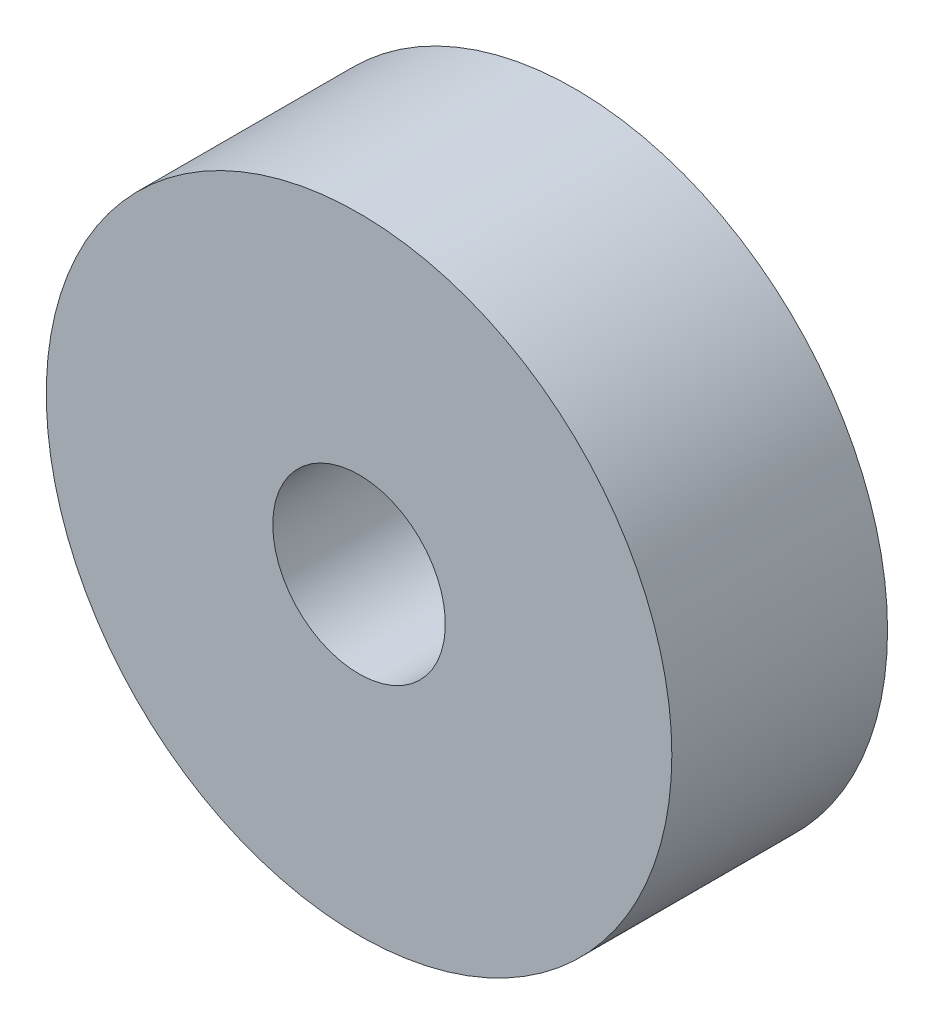
ISO-10303-21;
HEADER;
FILE_DESCRIPTION(('STEP AP214'),'2;1');
FILE_NAME('part.step','',(''),(''),'','','');
FILE_SCHEMA(('AUTOMOTIVE_DESIGN { 1 0 10303 214 1 1 1 1 }'));
ENDSEC;
DATA;
#1=APPLICATION_CONTEXT('core data for automotive mechanical design processes');
#2=APPLICATION_PROTOCOL_DEFINITION('international standard','automotive_design',2000,#1);
#3=PRODUCT_CONTEXT('',#1,'mechanical');
#4=PRODUCT('Part','Part','',(#3));
#5=PRODUCT_RELATED_PRODUCT_CATEGORY('part','',(#4));
#6=PRODUCT_DEFINITION_FORMATION('','',#4);
#7=PRODUCT_DEFINITION_CONTEXT('part definition',#1,'design');
#8=PRODUCT_DEFINITION('design','',#6,#7);
#9=PRODUCT_DEFINITION_SHAPE('','',#8);
#10=(LENGTH_UNIT() NAMED_UNIT(*) SI_UNIT(.MILLI.,.METRE.));
#11=(NAMED_UNIT(*) PLANE_ANGLE_UNIT() SI_UNIT($,.RADIAN.));
#12=(NAMED_UNIT(*) SI_UNIT($,.STERADIAN.) SOLID_ANGLE_UNIT());
#13=UNCERTAINTY_MEASURE_WITH_UNIT(LENGTH_MEASURE(1.E-05),#10,'distance_accuracy_value','');
#14=(GEOMETRIC_REPRESENTATION_CONTEXT(3) GLOBAL_UNCERTAINTY_ASSIGNED_CONTEXT((#13)) GLOBAL_UNIT_ASSIGNED_CONTEXT((#10,
#11,#12)) REPRESENTATION_CONTEXT('',''));
#15=CARTESIAN_POINT('',(0.,0.,0.));
#16=DIRECTION('',(0.,0.,1.));
#17=DIRECTION('',(1.,0.,0.));
#18=AXIS2_PLACEMENT_3D('',#15,#16,#17);
#19=CARTESIAN_POINT('',(0.,0.,12.7));
#20=DIRECTION('',(0.,0.,-1.));
#21=DIRECTION('',(-1.,0.,0.));
#22=AXIS2_PLACEMENT_3D('',#19,#20,#21);
#23=CYLINDRICAL_SURFACE('',#22,18.415);
#24=CARTESIAN_POINT('',(0.,0.,12.7));
#25=DIRECTION('',(0.,0.,1.));
#26=DIRECTION('',(1.,0.,0.));
#27=AXIS2_PLACEMENT_3D('',#24,#25,#26);
#28=CIRCLE('',#27,18.415);
#29=CARTESIAN_POINT('',(18.415,0.,12.7));
#30=VERTEX_POINT('',#29);
#31=EDGE_CURVE('E10',#30,#30,#28,.T.);
#32=ORIENTED_EDGE('',*,*,#31,.F.);
#33=EDGE_LOOP('',(#32));
#34=FACE_BOUND('',#33,.T.);
#35=CARTESIAN_POINT('',(0.,0.,0.));
#36=DIRECTION('',(0.,0.,1.));
#37=DIRECTION('',(1.,0.,0.));
#38=AXIS2_PLACEMENT_3D('',#35,#36,#37);
#39=CIRCLE('',#38,18.415);
#40=CARTESIAN_POINT('',(18.415,0.,0.));
#41=VERTEX_POINT('',#40);
#42=EDGE_CURVE('E34',#41,#41,#39,.T.);
#43=ORIENTED_EDGE('',*,*,#42,.T.);
#44=EDGE_LOOP('',(#43));
#45=FACE_BOUND('',#44,.T.);
#46=ADVANCED_FACE('F31',(#34,#45),#23,.T.);
#47=CARTESIAN_POINT('',(0.,0.,12.7));
#48=DIRECTION('',(0.,0.,1.));
#49=DIRECTION('',(1.,0.,0.));
#50=AXIS2_PLACEMENT_3D('',#47,#48,#49);
#51=PLANE('',#50);
#52=CARTESIAN_POINT('',(0.,0.,12.7));
#53=DIRECTION('',(0.,0.,-1.));
#54=DIRECTION('',(-1.,0.,0.));
#55=AXIS2_PLACEMENT_3D('',#52,#53,#54);
#56=CIRCLE('',#55,5.08);
#57=CARTESIAN_POINT('',(-5.08,0.,12.7));
#58=VERTEX_POINT('',#57);
#59=EDGE_CURVE('E41',#58,#58,#56,.T.);
#60=ORIENTED_EDGE('',*,*,#59,.T.);
#61=EDGE_LOOP('',(#60));
#62=FACE_BOUND('',#61,.T.);
#63=ORIENTED_EDGE('',*,*,#31,.T.);
#64=EDGE_LOOP('',(#63));
#65=FACE_BOUND('',#64,.T.);
#66=ADVANCED_FACE('F49',(#62,#65),#51,.T.);
#67=CARTESIAN_POINT('',(0.,0.,0.));
#68=DIRECTION('',(0.,0.,1.));
#69=DIRECTION('',(1.,0.,0.));
#70=AXIS2_PLACEMENT_3D('',#67,#68,#69);
#71=PLANE('',#70);
#72=CARTESIAN_POINT('',(0.,0.,0.));
#73=DIRECTION('',(0.,0.,-1.));
#74=DIRECTION('',(-1.,0.,0.));
#75=AXIS2_PLACEMENT_3D('',#72,#73,#74);
#76=CIRCLE('',#75,5.08);
#77=CARTESIAN_POINT('',(-5.08,0.,0.));
#78=VERTEX_POINT('',#77);
#79=EDGE_CURVE('E43',#78,#78,#76,.T.);
#80=ORIENTED_EDGE('',*,*,#79,.F.);
#81=EDGE_LOOP('',(#80));
#82=FACE_BOUND('',#81,.T.);
#83=ORIENTED_EDGE('',*,*,#42,.F.);
#84=EDGE_LOOP('',(#83));
#85=FACE_BOUND('',#84,.T.);
#86=ADVANCED_FACE('F54',(#82,#85),#71,.F.);
#87=CARTESIAN_POINT('',(0.,0.,12.7));
#88=DIRECTION('',(0.,0.,-1.));
#89=DIRECTION('',(-1.,0.,0.));
#90=AXIS2_PLACEMENT_3D('',#87,#88,#89);
#91=CYLINDRICAL_SURFACE('',#90,5.08);
#92=ORIENTED_EDGE('',*,*,#59,.F.);
#93=EDGE_LOOP('',(#92));
#94=FACE_BOUND('',#93,.T.);
#95=ORIENTED_EDGE('',*,*,#79,.T.);
#96=EDGE_LOOP('',(#95));
#97=FACE_BOUND('',#96,.T.);
#98=ADVANCED_FACE('F51',(#94,#97),#91,.F.);
#99=CLOSED_SHELL('',(#46,#66,#86,#98));
#100=MANIFOLD_SOLID_BREP('B2',#99);
#101=ADVANCED_BREP_SHAPE_REPRESENTATION('',(#18,#100),#14);
#102=SHAPE_DEFINITION_REPRESENTATION(#9,#101);
ENDSEC;
END-ISO-10303-21;
